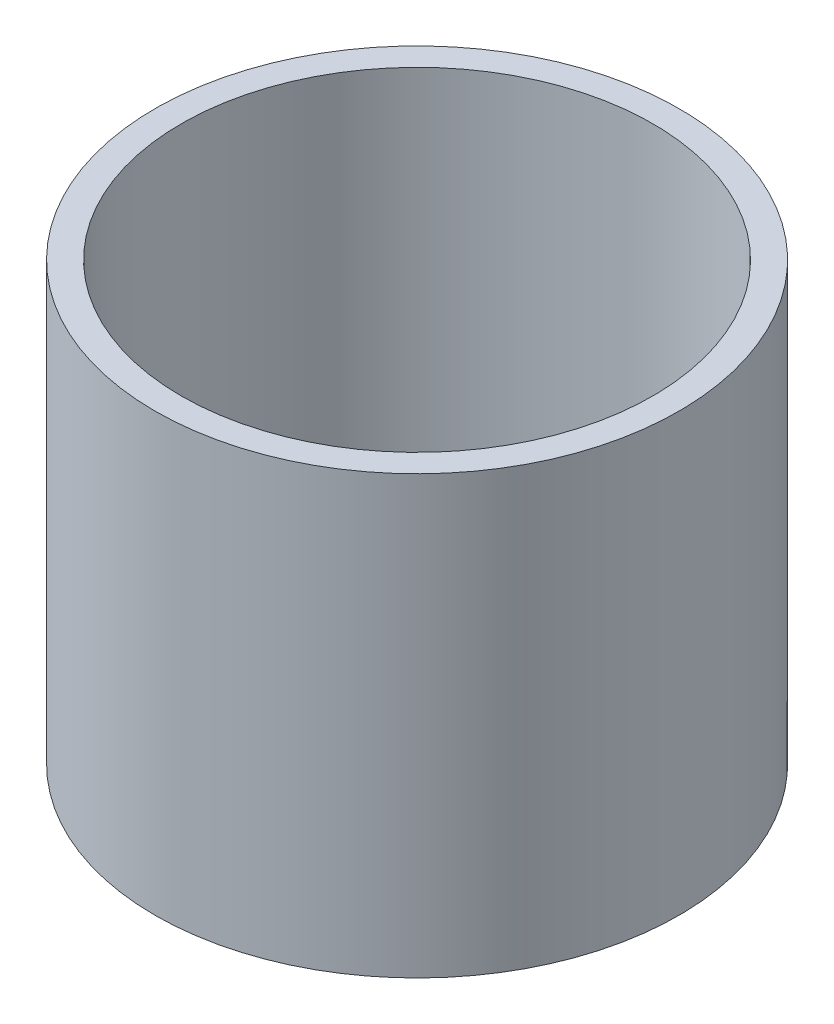
ISO-10303-21;
HEADER;
FILE_DESCRIPTION(('STEP AP214'),'2;1');
FILE_NAME('part.step','',(''),(''),'','','');
FILE_SCHEMA(('AUTOMOTIVE_DESIGN { 1 0 10303 214 1 1 1 1 }'));
ENDSEC;
DATA;
#1=APPLICATION_CONTEXT('core data for automotive mechanical design processes');
#2=APPLICATION_PROTOCOL_DEFINITION('international standard','automotive_design',2000,#1);
#3=PRODUCT_CONTEXT('',#1,'mechanical');
#4=PRODUCT('Part','Part','',(#3));
#5=PRODUCT_RELATED_PRODUCT_CATEGORY('part','',(#4));
#6=PRODUCT_DEFINITION_FORMATION('','',#4);
#7=PRODUCT_DEFINITION_CONTEXT('part definition',#1,'design');
#8=PRODUCT_DEFINITION('design','',#6,#7);
#9=PRODUCT_DEFINITION_SHAPE('','',#8);
#10=(LENGTH_UNIT() NAMED_UNIT(*) SI_UNIT(.MILLI.,.METRE.));
#11=(NAMED_UNIT(*) PLANE_ANGLE_UNIT() SI_UNIT($,.RADIAN.));
#12=(NAMED_UNIT(*) SI_UNIT($,.STERADIAN.) SOLID_ANGLE_UNIT());
#13=UNCERTAINTY_MEASURE_WITH_UNIT(LENGTH_MEASURE(1.E-05),#10,'distance_accuracy_value','');
#14=(GEOMETRIC_REPRESENTATION_CONTEXT(3) GLOBAL_UNCERTAINTY_ASSIGNED_CONTEXT((#13)) GLOBAL_UNIT_ASSIGNED_CONTEXT((#10,
#11,#12)) REPRESENTATION_CONTEXT('',''));
#15=CARTESIAN_POINT('',(0.,0.,0.));
#16=DIRECTION('',(0.,0.,1.));
#17=DIRECTION('',(1.,0.,0.));
#18=AXIS2_PLACEMENT_3D('',#15,#16,#17);
#19=CARTESIAN_POINT('',(-21.6509836038174,50.,-19.0528655713593));
#20=DIRECTION('',(0.,-1.,0.));
#21=DIRECTION('',(0.,0.,-1.));
#22=AXIS2_PLACEMENT_3D('',#19,#20,#21);
#23=CYLINDRICAL_SURFACE('',#22,30.);
#24=CARTESIAN_POINT('',(-21.6509836038174,50.,-19.0528655713593));
#25=DIRECTION('',(0.,1.,0.));
#26=DIRECTION('',(0.,0.,1.));
#27=AXIS2_PLACEMENT_3D('',#24,#25,#26);
#28=CIRCLE('',#27,30.);
#29=CARTESIAN_POINT('',(-21.6509836038174,50.,10.9471344286407));
#30=VERTEX_POINT('',#29);
#31=EDGE_CURVE('E10',#30,#30,#28,.T.);
#32=ORIENTED_EDGE('',*,*,#31,.F.);
#33=EDGE_LOOP('',(#32));
#34=FACE_BOUND('',#33,.T.);
#35=CARTESIAN_POINT('',(-21.6509836038174,0.,-19.0528655713593));
#36=DIRECTION('',(0.,1.,0.));
#37=DIRECTION('',(0.,0.,1.));
#38=AXIS2_PLACEMENT_3D('',#35,#36,#37);
#39=CIRCLE('',#38,30.);
#40=CARTESIAN_POINT('',(-21.6509836038174,0.,10.9471344286407));
#41=VERTEX_POINT('',#40);
#42=EDGE_CURVE('E37',#41,#41,#39,.T.);
#43=ORIENTED_EDGE('',*,*,#42,.T.);
#44=EDGE_LOOP('',(#43));
#45=FACE_BOUND('',#44,.T.);
#46=ADVANCED_FACE('F40',(#34,#45),#23,.T.);
#47=CARTESIAN_POINT('',(-21.6509836038174,50.,-19.0528655713593));
#48=DIRECTION('',(0.,1.,0.));
#49=DIRECTION('',(0.,0.,1.));
#50=AXIS2_PLACEMENT_3D('',#47,#48,#49);
#51=PLANE('',#50);
#52=CARTESIAN_POINT('',(-21.6509836038174,50.,-19.0528655713593));
#53=DIRECTION('',(0.,1.,0.));
#54=DIRECTION('',(0.,0.,1.));
#55=AXIS2_PLACEMENT_3D('',#52,#53,#54);
#56=CIRCLE('',#55,27.);
#57=CARTESIAN_POINT('',(-21.6509836038174,50.,7.94713442864068));
#58=VERTEX_POINT('',#57);
#59=EDGE_CURVE('E47',#58,#58,#56,.T.);
#60=ORIENTED_EDGE('',*,*,#59,.F.);
#61=EDGE_LOOP('',(#60));
#62=FACE_BOUND('',#61,.T.);
#63=ORIENTED_EDGE('',*,*,#31,.T.);
#64=EDGE_LOOP('',(#63));
#65=FACE_BOUND('',#64,.T.);
#66=ADVANCED_FACE('F61',(#62,#65),#51,.T.);
#67=CARTESIAN_POINT('',(-21.6509836038174,0.,-19.0528655713593));
#68=DIRECTION('',(0.,1.,0.));
#69=DIRECTION('',(0.,0.,1.));
#70=AXIS2_PLACEMENT_3D('',#67,#68,#69);
#71=PLANE('',#70);
#72=ORIENTED_EDGE('',*,*,#42,.F.);
#73=EDGE_LOOP('',(#72));
#74=FACE_BOUND('',#73,.T.);
#75=ADVANCED_FACE('F58',(#74),#71,.F.);
#76=CARTESIAN_POINT('',(-21.6509836038174,3.,-19.0528655713593));
#77=DIRECTION('',(0.,1.,0.));
#78=DIRECTION('',(0.,0.,1.));
#79=AXIS2_PLACEMENT_3D('',#76,#77,#78);
#80=CYLINDRICAL_SURFACE('',#79,27.);
#81=CARTESIAN_POINT('',(-21.6509836038174,3.,-19.0528655713593));
#82=DIRECTION('',(0.,1.,0.));
#83=DIRECTION('',(0.,0.,1.));
#84=AXIS2_PLACEMENT_3D('',#81,#82,#83);
#85=CIRCLE('',#84,27.);
#86=CARTESIAN_POINT('',(-21.6509836038174,3.,7.94713442864068));
#87=VERTEX_POINT('',#86);
#88=EDGE_CURVE('E50',#87,#87,#85,.T.);
#89=ORIENTED_EDGE('',*,*,#88,.F.);
#90=EDGE_LOOP('',(#89));
#91=FACE_BOUND('',#90,.T.);
#92=ORIENTED_EDGE('',*,*,#59,.T.);
#93=EDGE_LOOP('',(#92));
#94=FACE_BOUND('',#93,.T.);
#95=ADVANCED_FACE('F60',(#91,#94),#80,.F.);
#96=CARTESIAN_POINT('',(-21.6509836038174,3.,-19.0528655713593));
#97=DIRECTION('',(0.,1.,0.));
#98=DIRECTION('',(0.,0.,1.));
#99=AXIS2_PLACEMENT_3D('',#96,#97,#98);
#100=PLANE('',#99);
#101=ORIENTED_EDGE('',*,*,#88,.T.);
#102=EDGE_LOOP('',(#101));
#103=FACE_BOUND('',#102,.T.);
#104=ADVANCED_FACE('F54',(#103),#100,.T.);
#105=CLOSED_SHELL('',(#46,#66,#75,#95,#104));
#106=MANIFOLD_SOLID_BREP('B2',#105);
#107=ADVANCED_BREP_SHAPE_REPRESENTATION('',(#18,#106),#14);
#108=SHAPE_DEFINITION_REPRESENTATION(#9,#107);
ENDSEC;
END-ISO-10303-21;
